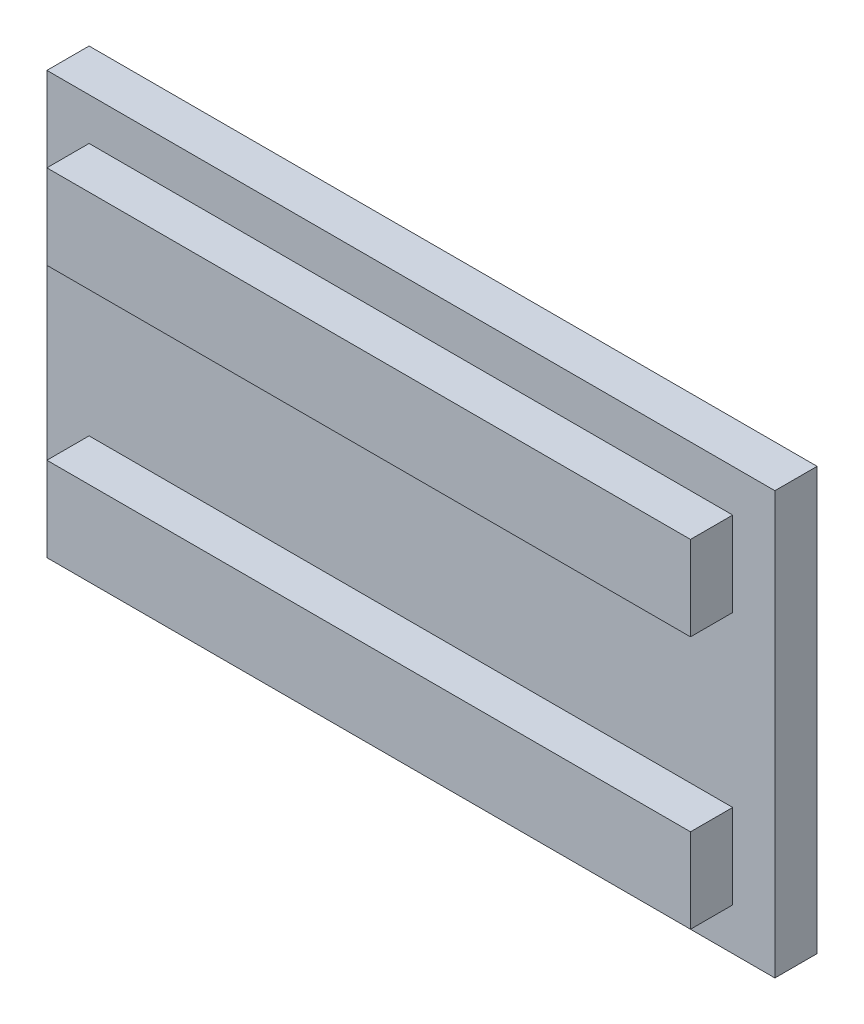
ISO-10303-21;
HEADER;
FILE_DESCRIPTION(('STEP AP214'),'2;1');
FILE_NAME('part.step','',(''),(''),'','','');
FILE_SCHEMA(('AUTOMOTIVE_DESIGN { 1 0 10303 214 1 1 1 1 }'));
ENDSEC;
DATA;
#1=APPLICATION_CONTEXT('core data for automotive mechanical design processes');
#2=APPLICATION_PROTOCOL_DEFINITION('international standard','automotive_design',2000,#1);
#3=PRODUCT_CONTEXT('',#1,'mechanical');
#4=PRODUCT('Part','Part','',(#3));
#5=PRODUCT_RELATED_PRODUCT_CATEGORY('part','',(#4));
#6=PRODUCT_DEFINITION_FORMATION('','',#4);
#7=PRODUCT_DEFINITION_CONTEXT('part definition',#1,'design');
#8=PRODUCT_DEFINITION('design','',#6,#7);
#9=PRODUCT_DEFINITION_SHAPE('','',#8);
#10=(LENGTH_UNIT() NAMED_UNIT(*) SI_UNIT(.MILLI.,.METRE.));
#11=(NAMED_UNIT(*) PLANE_ANGLE_UNIT() SI_UNIT($,.RADIAN.));
#12=(NAMED_UNIT(*) SI_UNIT($,.STERADIAN.) SOLID_ANGLE_UNIT());
#13=UNCERTAINTY_MEASURE_WITH_UNIT(LENGTH_MEASURE(1.E-05),#10,'distance_accuracy_value','');
#14=(GEOMETRIC_REPRESENTATION_CONTEXT(3) GLOBAL_UNCERTAINTY_ASSIGNED_CONTEXT((#13)) GLOBAL_UNIT_ASSIGNED_CONTEXT((#10,
#11,#12)) REPRESENTATION_CONTEXT('',''));
#15=CARTESIAN_POINT('',(0.,0.,0.));
#16=DIRECTION('',(0.,0.,1.));
#17=DIRECTION('',(1.,0.,0.));
#18=AXIS2_PLACEMENT_3D('',#15,#16,#17);
#19=CARTESIAN_POINT('',(0.,0.,2.));
#20=DIRECTION('',(0.,0.,1.));
#21=DIRECTION('',(1.,0.,0.));
#22=AXIS2_PLACEMENT_3D('',#19,#20,#21);
#23=PLANE('',#22);
#24=DIRECTION('',(0.,1.,0.));
#25=VECTOR('',#24,1.);
#26=CARTESIAN_POINT('',(17.25,10.,2.));
#27=LINE('',#26,#25);
#28=CARTESIAN_POINT('',(17.25,-10.,2.));
#29=VERTEX_POINT('',#28);
#30=CARTESIAN_POINT('',(17.25,10.,2.));
#31=VERTEX_POINT('',#30);
#32=EDGE_CURVE('E213',#29,#31,#27,.T.);
#33=ORIENTED_EDGE('',*,*,#32,.T.);
#34=DIRECTION('',(-1.,0.,0.));
#35=VECTOR('',#34,1.);
#36=CARTESIAN_POINT('',(-17.25,10.,2.));
#37=LINE('',#36,#35);
#38=CARTESIAN_POINT('',(-17.25,10.,2.));
#39=VERTEX_POINT('',#38);
#40=EDGE_CURVE('E217',#31,#39,#37,.T.);
#41=ORIENTED_EDGE('',*,*,#40,.T.);
#42=DIRECTION('',(0.,-1.,0.));
#43=VECTOR('',#42,1.);
#44=CARTESIAN_POINT('',(-17.25,10.,2.));
#45=LINE('',#44,#43);
#46=CARTESIAN_POINT('',(-17.25,-10.,2.));
#47=VERTEX_POINT('',#46);
#48=EDGE_CURVE('E221',#39,#47,#45,.T.);
#49=ORIENTED_EDGE('',*,*,#48,.T.);
#50=DIRECTION('',(1.,0.,0.));
#51=VECTOR('',#50,1.);
#52=CARTESIAN_POINT('',(-17.25,-10.,2.));
#53=LINE('',#52,#51);
#54=EDGE_CURVE('E224',#47,#29,#53,.T.);
#55=ORIENTED_EDGE('',*,*,#54,.T.);
#56=EDGE_LOOP('',(#33,#41,#49,#55));
#57=FACE_BOUND('',#56,.T.);
#58=DIRECTION('',(1.,0.,0.));
#59=VECTOR('',#58,1.);
#60=CARTESIAN_POINT('',(-15.25,-8.,2.));
#61=LINE('',#60,#59);
#62=CARTESIAN_POINT('',(-15.25,-8.,2.));
#63=VERTEX_POINT('',#62);
#64=CARTESIAN_POINT('',(15.25,-8.00000000000001,2.));
#65=VERTEX_POINT('',#64);
#66=EDGE_CURVE('E195',#63,#65,#61,.T.);
#67=ORIENTED_EDGE('',*,*,#66,.F.);
#68=DIRECTION('',(0.,-1.,0.));
#69=VECTOR('',#68,1.);
#70=CARTESIAN_POINT('',(-15.25,-4.,2.));
#71=LINE('',#70,#69);
#72=CARTESIAN_POINT('',(-15.25,-4.,2.));
#73=VERTEX_POINT('',#72);
#74=EDGE_CURVE('E198',#73,#63,#71,.T.);
#75=ORIENTED_EDGE('',*,*,#74,.F.);
#76=DIRECTION('',(-1.,0.,0.));
#77=VECTOR('',#76,1.);
#78=CARTESIAN_POINT('',(-15.25,-4.,2.));
#79=LINE('',#78,#77);
#80=CARTESIAN_POINT('',(15.25,-4.,2.));
#81=VERTEX_POINT('',#80);
#82=EDGE_CURVE('E188',#81,#73,#79,.T.);
#83=ORIENTED_EDGE('',*,*,#82,.F.);
#84=DIRECTION('',(0.,1.,0.));
#85=VECTOR('',#84,1.);
#86=CARTESIAN_POINT('',(15.25,-4.,2.));
#87=LINE('',#86,#85);
#88=EDGE_CURVE('E191',#65,#81,#87,.T.);
#89=ORIENTED_EDGE('',*,*,#88,.F.);
#90=EDGE_LOOP('',(#67,#75,#83,#89));
#91=FACE_BOUND('',#90,.T.);
#92=DIRECTION('',(0.,-1.,0.));
#93=VECTOR('',#92,1.);
#94=CARTESIAN_POINT('',(-15.25,8.,2.));
#95=LINE('',#94,#93);
#96=CARTESIAN_POINT('',(-15.25,8.,2.));
#97=VERTEX_POINT('',#96);
#98=CARTESIAN_POINT('',(-15.25,4.,2.));
#99=VERTEX_POINT('',#98);
#100=EDGE_CURVE('E396',#97,#99,#95,.T.);
#101=ORIENTED_EDGE('',*,*,#100,.F.);
#102=DIRECTION('',(-1.,0.,0.));
#103=VECTOR('',#102,1.);
#104=CARTESIAN_POINT('',(-15.25,8.,2.));
#105=LINE('',#104,#103);
#106=CARTESIAN_POINT('',(15.25,8.,2.));
#107=VERTEX_POINT('',#106);
#108=EDGE_CURVE('E161',#107,#97,#105,.T.);
#109=ORIENTED_EDGE('',*,*,#108,.F.);
#110=DIRECTION('',(0.,1.,0.));
#111=VECTOR('',#110,1.);
#112=CARTESIAN_POINT('',(15.25,8.,2.));
#113=LINE('',#112,#111);
#114=CARTESIAN_POINT('',(15.25,4.,2.));
#115=VERTEX_POINT('',#114);
#116=EDGE_CURVE('E157',#115,#107,#113,.T.);
#117=ORIENTED_EDGE('',*,*,#116,.F.);
#118=DIRECTION('',(1.,0.,0.));
#119=VECTOR('',#118,1.);
#120=CARTESIAN_POINT('',(-15.25,4.,2.));
#121=LINE('',#120,#119);
#122=EDGE_CURVE('E392',#99,#115,#121,.T.);
#123=ORIENTED_EDGE('',*,*,#122,.F.);
#124=EDGE_LOOP('',(#101,#109,#117,#123));
#125=FACE_BOUND('',#124,.T.);
#126=ADVANCED_FACE('F45',(#57,#91,#125),#23,.T.);
#127=CARTESIAN_POINT('',(17.25,10.,2.));
#128=DIRECTION('',(-1.,0.,0.));
#129=DIRECTION('',(0.,0.,1.));
#130=AXIS2_PLACEMENT_3D('',#127,#128,#129);
#131=PLANE('',#130);
#132=DIRECTION('',(0.,1.,0.));
#133=VECTOR('',#132,1.);
#134=CARTESIAN_POINT('',(17.25,10.,0.));
#135=LINE('',#134,#133);
#136=CARTESIAN_POINT('',(17.25,-10.,0.));
#137=VERTEX_POINT('',#136);
#138=CARTESIAN_POINT('',(17.25,10.,0.));
#139=VERTEX_POINT('',#138);
#140=EDGE_CURVE('E164',#137,#139,#135,.T.);
#141=ORIENTED_EDGE('',*,*,#140,.T.);
#142=DIRECTION('',(0.,0.,-1.));
#143=VECTOR('',#142,1.);
#144=CARTESIAN_POINT('',(17.25,10.,2.));
#145=LINE('',#144,#143);
#146=EDGE_CURVE('E11',#31,#139,#145,.T.);
#147=ORIENTED_EDGE('',*,*,#146,.F.);
#148=ORIENTED_EDGE('',*,*,#32,.F.);
#149=DIRECTION('',(0.,0.,-1.));
#150=VECTOR('',#149,1.);
#151=CARTESIAN_POINT('',(17.25,-10.,2.));
#152=LINE('',#151,#150);
#153=EDGE_CURVE('E226',#29,#137,#152,.T.);
#154=ORIENTED_EDGE('',*,*,#153,.T.);
#155=EDGE_LOOP('',(#141,#147,#148,#154));
#156=FACE_BOUND('',#155,.T.);
#157=ADVANCED_FACE('F47',(#156),#131,.F.);
#158=CARTESIAN_POINT('',(-17.25,10.,2.));
#159=DIRECTION('',(0.,-1.,0.));
#160=DIRECTION('',(0.,0.,-1.));
#161=AXIS2_PLACEMENT_3D('',#158,#159,#160);
#162=PLANE('',#161);
#163=DIRECTION('',(-1.,0.,0.));
#164=VECTOR('',#163,1.);
#165=CARTESIAN_POINT('',(-17.25,10.,0.));
#166=LINE('',#165,#164);
#167=CARTESIAN_POINT('',(-17.25,10.,0.));
#168=VERTEX_POINT('',#167);
#169=EDGE_CURVE('E169',#139,#168,#166,.T.);
#170=ORIENTED_EDGE('',*,*,#169,.T.);
#171=DIRECTION('',(0.,0.,-1.));
#172=VECTOR('',#171,1.);
#173=CARTESIAN_POINT('',(-17.25,10.,2.));
#174=LINE('',#173,#172);
#175=EDGE_CURVE('E54',#39,#168,#174,.T.);
#176=ORIENTED_EDGE('',*,*,#175,.F.);
#177=ORIENTED_EDGE('',*,*,#40,.F.);
#178=ORIENTED_EDGE('',*,*,#146,.T.);
#179=EDGE_LOOP('',(#170,#176,#177,#178));
#180=FACE_BOUND('',#179,.T.);
#181=ADVANCED_FACE('F263',(#180),#162,.F.);
#182=CARTESIAN_POINT('',(-17.25,10.,2.));
#183=DIRECTION('',(1.,0.,0.));
#184=DIRECTION('',(0.,0.,-1.));
#185=AXIS2_PLACEMENT_3D('',#182,#183,#184);
#186=PLANE('',#185);
#187=DIRECTION('',(0.,-1.,0.));
#188=VECTOR('',#187,1.);
#189=CARTESIAN_POINT('',(-17.25,10.,0.));
#190=LINE('',#189,#188);
#191=CARTESIAN_POINT('',(-17.25,-10.,0.));
#192=VERTEX_POINT('',#191);
#193=EDGE_CURVE('E230',#168,#192,#190,.T.);
#194=ORIENTED_EDGE('',*,*,#193,.T.);
#195=DIRECTION('',(0.,0.,-1.));
#196=VECTOR('',#195,1.);
#197=CARTESIAN_POINT('',(-17.25,-10.,2.));
#198=LINE('',#197,#196);
#199=EDGE_CURVE('E238',#47,#192,#198,.T.);
#200=ORIENTED_EDGE('',*,*,#199,.F.);
#201=ORIENTED_EDGE('',*,*,#48,.F.);
#202=ORIENTED_EDGE('',*,*,#175,.T.);
#203=EDGE_LOOP('',(#194,#200,#201,#202));
#204=FACE_BOUND('',#203,.T.);
#205=ADVANCED_FACE('F247',(#204),#186,.F.);
#206=CARTESIAN_POINT('',(-17.25,-10.,2.));
#207=DIRECTION('',(0.,1.,0.));
#208=DIRECTION('',(0.,0.,1.));
#209=AXIS2_PLACEMENT_3D('',#206,#207,#208);
#210=PLANE('',#209);
#211=DIRECTION('',(1.,0.,0.));
#212=VECTOR('',#211,1.);
#213=CARTESIAN_POINT('',(-17.25,-10.,0.));
#214=LINE('',#213,#212);
#215=EDGE_CURVE('E218',#192,#137,#214,.T.);
#216=ORIENTED_EDGE('',*,*,#215,.T.);
#217=ORIENTED_EDGE('',*,*,#153,.F.);
#218=ORIENTED_EDGE('',*,*,#54,.F.);
#219=ORIENTED_EDGE('',*,*,#199,.T.);
#220=EDGE_LOOP('',(#216,#217,#218,#219));
#221=FACE_BOUND('',#220,.T.);
#222=ADVANCED_FACE('F256',(#221),#210,.F.);
#223=CARTESIAN_POINT('',(0.,0.,0.));
#224=DIRECTION('',(0.,0.,1.));
#225=DIRECTION('',(1.,0.,0.));
#226=AXIS2_PLACEMENT_3D('',#223,#224,#225);
#227=PLANE('',#226);
#228=ORIENTED_EDGE('',*,*,#140,.F.);
#229=ORIENTED_EDGE('',*,*,#215,.F.);
#230=ORIENTED_EDGE('',*,*,#193,.F.);
#231=ORIENTED_EDGE('',*,*,#169,.F.);
#232=EDGE_LOOP('',(#228,#229,#230,#231));
#233=FACE_BOUND('',#232,.T.);
#234=ADVANCED_FACE('F253',(#233),#227,.F.);
#235=CARTESIAN_POINT('',(-15.25,-4.,4.));
#236=DIRECTION('',(1.,0.,0.));
#237=DIRECTION('',(0.,0.,-1.));
#238=AXIS2_PLACEMENT_3D('',#235,#236,#237);
#239=PLANE('',#238);
#240=ORIENTED_EDGE('',*,*,#74,.T.);
#241=DIRECTION('',(0.,0.,-1.));
#242=VECTOR('',#241,1.);
#243=CARTESIAN_POINT('',(-15.25,-8.,4.));
#244=LINE('',#243,#242);
#245=CARTESIAN_POINT('',(-15.25,-8.,4.));
#246=VERTEX_POINT('',#245);
#247=EDGE_CURVE('E174',#246,#63,#244,.T.);
#248=ORIENTED_EDGE('',*,*,#247,.F.);
#249=DIRECTION('',(0.,-1.,0.));
#250=VECTOR('',#249,1.);
#251=CARTESIAN_POINT('',(-15.25,-4.,4.));
#252=LINE('',#251,#250);
#253=CARTESIAN_POINT('',(-15.25,-4.,4.));
#254=VERTEX_POINT('',#253);
#255=EDGE_CURVE('E192',#254,#246,#252,.T.);
#256=ORIENTED_EDGE('',*,*,#255,.F.);
#257=DIRECTION('',(0.,0.,-1.));
#258=VECTOR('',#257,1.);
#259=CARTESIAN_POINT('',(-15.25,-4.,4.));
#260=LINE('',#259,#258);
#261=EDGE_CURVE('E183',#254,#73,#260,.T.);
#262=ORIENTED_EDGE('',*,*,#261,.T.);
#263=EDGE_LOOP('',(#240,#248,#256,#262));
#264=FACE_BOUND('',#263,.T.);
#265=ADVANCED_FACE('F281',(#264),#239,.F.);
#266=CARTESIAN_POINT('',(-15.25,-8.,4.));
#267=DIRECTION('',(0.,1.,0.));
#268=DIRECTION('',(-1.,0.,0.));
#269=AXIS2_PLACEMENT_3D('',#266,#267,#268);
#270=PLANE('',#269);
#271=ORIENTED_EDGE('',*,*,#66,.T.);
#272=DIRECTION('',(0.,0.,-1.));
#273=VECTOR('',#272,1.);
#274=CARTESIAN_POINT('',(15.25,-8.00000000000001,4.));
#275=LINE('',#274,#273);
#276=CARTESIAN_POINT('',(15.25,-8.00000000000001,4.));
#277=VERTEX_POINT('',#276);
#278=EDGE_CURVE('E177',#277,#65,#275,.T.);
#279=ORIENTED_EDGE('',*,*,#278,.F.);
#280=DIRECTION('',(1.,0.,0.));
#281=VECTOR('',#280,1.);
#282=CARTESIAN_POINT('',(-15.25,-8.,4.));
#283=LINE('',#282,#281);
#284=EDGE_CURVE('E207',#246,#277,#283,.T.);
#285=ORIENTED_EDGE('',*,*,#284,.F.);
#286=ORIENTED_EDGE('',*,*,#247,.T.);
#287=EDGE_LOOP('',(#271,#279,#285,#286));
#288=FACE_BOUND('',#287,.T.);
#289=ADVANCED_FACE('F305',(#288),#270,.F.);
#290=CARTESIAN_POINT('',(15.25,-4.,4.));
#291=DIRECTION('',(-1.,0.,0.));
#292=DIRECTION('',(0.,0.,1.));
#293=AXIS2_PLACEMENT_3D('',#290,#291,#292);
#294=PLANE('',#293);
#295=ORIENTED_EDGE('',*,*,#88,.T.);
#296=DIRECTION('',(0.,0.,-1.));
#297=VECTOR('',#296,1.);
#298=CARTESIAN_POINT('',(15.25,-4.,4.));
#299=LINE('',#298,#297);
#300=CARTESIAN_POINT('',(15.25,-4.,4.));
#301=VERTEX_POINT('',#300);
#302=EDGE_CURVE('E69',#301,#81,#299,.T.);
#303=ORIENTED_EDGE('',*,*,#302,.F.);
#304=DIRECTION('',(0.,1.,0.));
#305=VECTOR('',#304,1.);
#306=CARTESIAN_POINT('',(15.25,-4.,4.));
#307=LINE('',#306,#305);
#308=EDGE_CURVE('E204',#277,#301,#307,.T.);
#309=ORIENTED_EDGE('',*,*,#308,.F.);
#310=ORIENTED_EDGE('',*,*,#278,.T.);
#311=EDGE_LOOP('',(#295,#303,#309,#310));
#312=FACE_BOUND('',#311,.T.);
#313=ADVANCED_FACE('F315',(#312),#294,.F.);
#314=CARTESIAN_POINT('',(-15.25,-4.,4.));
#315=DIRECTION('',(0.,-1.,0.));
#316=DIRECTION('',(0.,0.,-1.));
#317=AXIS2_PLACEMENT_3D('',#314,#315,#316);
#318=PLANE('',#317);
#319=ORIENTED_EDGE('',*,*,#82,.T.);
#320=ORIENTED_EDGE('',*,*,#261,.F.);
#321=DIRECTION('',(-1.,0.,0.));
#322=VECTOR('',#321,1.);
#323=CARTESIAN_POINT('',(-15.25,-4.,4.));
#324=LINE('',#323,#322);
#325=EDGE_CURVE('E187',#301,#254,#324,.T.);
#326=ORIENTED_EDGE('',*,*,#325,.F.);
#327=ORIENTED_EDGE('',*,*,#302,.T.);
#328=EDGE_LOOP('',(#319,#320,#326,#327));
#329=FACE_BOUND('',#328,.T.);
#330=ADVANCED_FACE('F325',(#329),#318,.F.);
#331=CARTESIAN_POINT('',(0.,0.,4.));
#332=DIRECTION('',(0.,0.,1.));
#333=DIRECTION('',(1.,0.,0.));
#334=AXIS2_PLACEMENT_3D('',#331,#332,#333);
#335=PLANE('',#334);
#336=ORIENTED_EDGE('',*,*,#255,.T.);
#337=ORIENTED_EDGE('',*,*,#284,.T.);
#338=ORIENTED_EDGE('',*,*,#308,.T.);
#339=ORIENTED_EDGE('',*,*,#325,.T.);
#340=EDGE_LOOP('',(#336,#337,#338,#339));
#341=FACE_BOUND('',#340,.T.);
#342=ADVANCED_FACE('F278',(#341),#335,.T.);
#343=CARTESIAN_POINT('',(-15.25,8.,4.));
#344=DIRECTION('',(0.,-1.,0.));
#345=DIRECTION('',(0.,0.,-1.));
#346=AXIS2_PLACEMENT_3D('',#343,#344,#345);
#347=PLANE('',#346);
#348=ORIENTED_EDGE('',*,*,#108,.T.);
#349=DIRECTION('',(0.,0.,-1.));
#350=VECTOR('',#349,1.);
#351=CARTESIAN_POINT('',(-15.25,8.,4.));
#352=LINE('',#351,#350);
#353=CARTESIAN_POINT('',(-15.25,8.,4.));
#354=VERTEX_POINT('',#353);
#355=EDGE_CURVE('E140',#354,#97,#352,.T.);
#356=ORIENTED_EDGE('',*,*,#355,.F.);
#357=DIRECTION('',(-1.,0.,0.));
#358=VECTOR('',#357,1.);
#359=CARTESIAN_POINT('',(-15.25,8.,4.));
#360=LINE('',#359,#358);
#361=CARTESIAN_POINT('',(15.25,8.,4.));
#362=VERTEX_POINT('',#361);
#363=EDGE_CURVE('E148',#362,#354,#360,.T.);
#364=ORIENTED_EDGE('',*,*,#363,.F.);
#365=DIRECTION('',(0.,0.,-1.));
#366=VECTOR('',#365,1.);
#367=CARTESIAN_POINT('',(15.25,8.,4.));
#368=LINE('',#367,#366);
#369=EDGE_CURVE('E388',#362,#107,#368,.T.);
#370=ORIENTED_EDGE('',*,*,#369,.T.);
#371=EDGE_LOOP('',(#348,#356,#364,#370));
#372=FACE_BOUND('',#371,.T.);
#373=ADVANCED_FACE('F159',(#372),#347,.F.);
#374=CARTESIAN_POINT('',(-15.25,8.,4.));
#375=DIRECTION('',(1.,0.,0.));
#376=DIRECTION('',(0.,0.,-1.));
#377=AXIS2_PLACEMENT_3D('',#374,#375,#376);
#378=PLANE('',#377);
#379=ORIENTED_EDGE('',*,*,#100,.T.);
#380=DIRECTION('',(0.,0.,-1.));
#381=VECTOR('',#380,1.);
#382=CARTESIAN_POINT('',(-15.25,4.,4.));
#383=LINE('',#382,#381);
#384=CARTESIAN_POINT('',(-15.25,4.,4.));
#385=VERTEX_POINT('',#384);
#386=EDGE_CURVE('E143',#385,#99,#383,.T.);
#387=ORIENTED_EDGE('',*,*,#386,.F.);
#388=DIRECTION('',(0.,-1.,0.));
#389=VECTOR('',#388,1.);
#390=CARTESIAN_POINT('',(-15.25,8.,4.));
#391=LINE('',#390,#389);
#392=EDGE_CURVE('E136',#354,#385,#391,.T.);
#393=ORIENTED_EDGE('',*,*,#392,.F.);
#394=ORIENTED_EDGE('',*,*,#355,.T.);
#395=EDGE_LOOP('',(#379,#387,#393,#394));
#396=FACE_BOUND('',#395,.T.);
#397=ADVANCED_FACE('F138',(#396),#378,.F.);
#398=CARTESIAN_POINT('',(-15.25,4.,4.));
#399=DIRECTION('',(0.,1.,0.));
#400=DIRECTION('',(0.,0.,1.));
#401=AXIS2_PLACEMENT_3D('',#398,#399,#400);
#402=PLANE('',#401);
#403=ORIENTED_EDGE('',*,*,#122,.T.);
#404=DIRECTION('',(0.,0.,-1.));
#405=VECTOR('',#404,1.);
#406=CARTESIAN_POINT('',(15.25,4.,4.));
#407=LINE('',#406,#405);
#408=CARTESIAN_POINT('',(15.25,4.,4.));
#409=VERTEX_POINT('',#408);
#410=EDGE_CURVE('E61',#409,#115,#407,.T.);
#411=ORIENTED_EDGE('',*,*,#410,.F.);
#412=DIRECTION('',(1.,0.,0.));
#413=VECTOR('',#412,1.);
#414=CARTESIAN_POINT('',(-15.25,4.,4.));
#415=LINE('',#414,#413);
#416=EDGE_CURVE('E147',#385,#409,#415,.T.);
#417=ORIENTED_EDGE('',*,*,#416,.F.);
#418=ORIENTED_EDGE('',*,*,#386,.T.);
#419=EDGE_LOOP('',(#403,#411,#417,#418));
#420=FACE_BOUND('',#419,.T.);
#421=ADVANCED_FACE('F358',(#420),#402,.F.);
#422=CARTESIAN_POINT('',(15.25,8.,4.));
#423=DIRECTION('',(-1.,0.,0.));
#424=DIRECTION('',(0.,-1.,0.));
#425=AXIS2_PLACEMENT_3D('',#422,#423,#424);
#426=PLANE('',#425);
#427=ORIENTED_EDGE('',*,*,#116,.T.);
#428=ORIENTED_EDGE('',*,*,#369,.F.);
#429=DIRECTION('',(0.,1.,0.));
#430=VECTOR('',#429,1.);
#431=CARTESIAN_POINT('',(15.25,8.,4.));
#432=LINE('',#431,#430);
#433=EDGE_CURVE('E152',#409,#362,#432,.T.);
#434=ORIENTED_EDGE('',*,*,#433,.F.);
#435=ORIENTED_EDGE('',*,*,#410,.T.);
#436=EDGE_LOOP('',(#427,#428,#434,#435));
#437=FACE_BOUND('',#436,.T.);
#438=ADVANCED_FACE('F367',(#437),#426,.F.);
#439=CARTESIAN_POINT('',(0.,0.,4.));
#440=DIRECTION('',(0.,0.,-1.));
#441=DIRECTION('',(-1.,0.,0.));
#442=AXIS2_PLACEMENT_3D('',#439,#440,#441);
#443=PLANE('',#442);
#444=ORIENTED_EDGE('',*,*,#363,.T.);
#445=ORIENTED_EDGE('',*,*,#392,.T.);
#446=ORIENTED_EDGE('',*,*,#416,.T.);
#447=ORIENTED_EDGE('',*,*,#433,.T.);
#448=EDGE_LOOP('',(#444,#445,#446,#447));
#449=FACE_BOUND('',#448,.T.);
#450=ADVANCED_FACE('F151',(#449),#443,.F.);
#451=CLOSED_SHELL('',(#126,#157,#181,#205,#222,#234,#265,#289,#313,#330,#342,#373,#397,#421,
#438,#450));
#452=MANIFOLD_SOLID_BREP('B2',#451);
#453=ADVANCED_BREP_SHAPE_REPRESENTATION('',(#18,#452),#14);
#454=SHAPE_DEFINITION_REPRESENTATION(#9,#453);
ENDSEC;
END-ISO-10303-21;
